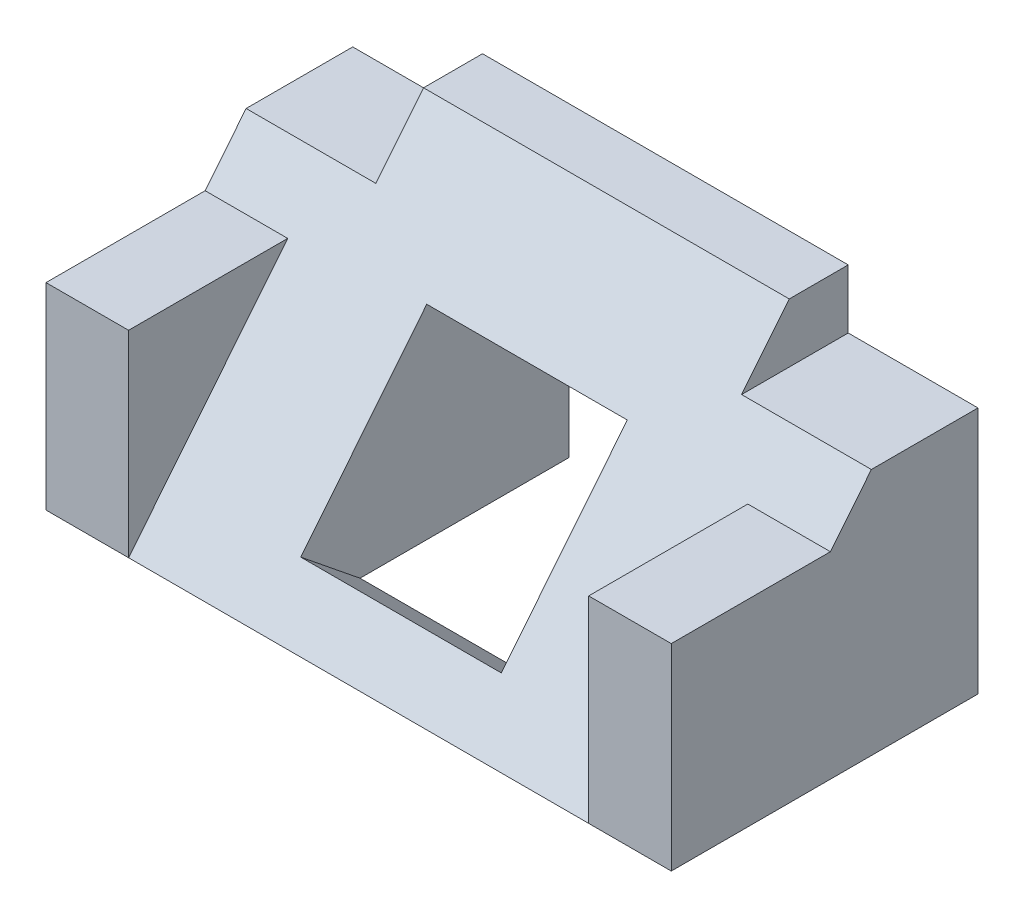
ISO-10303-21;
HEADER;
FILE_DESCRIPTION(('STEP AP214'),'2;1');
FILE_NAME('part.step','',(''),(''),'','','');
FILE_SCHEMA(('AUTOMOTIVE_DESIGN { 1 0 10303 214 1 1 1 1 }'));
ENDSEC;
DATA;
#1=APPLICATION_CONTEXT('core data for automotive mechanical design processes');
#2=APPLICATION_PROTOCOL_DEFINITION('international standard','automotive_design',2000,#1);
#3=PRODUCT_CONTEXT('',#1,'mechanical');
#4=PRODUCT('Part','Part','',(#3));
#5=PRODUCT_RELATED_PRODUCT_CATEGORY('part','',(#4));
#6=PRODUCT_DEFINITION_FORMATION('','',#4);
#7=PRODUCT_DEFINITION_CONTEXT('part definition',#1,'design');
#8=PRODUCT_DEFINITION('design','',#6,#7);
#9=PRODUCT_DEFINITION_SHAPE('','',#8);
#10=(LENGTH_UNIT() NAMED_UNIT(*) SI_UNIT(.MILLI.,.METRE.));
#11=(NAMED_UNIT(*) PLANE_ANGLE_UNIT() SI_UNIT($,.RADIAN.));
#12=(NAMED_UNIT(*) SI_UNIT($,.STERADIAN.) SOLID_ANGLE_UNIT());
#13=UNCERTAINTY_MEASURE_WITH_UNIT(LENGTH_MEASURE(1.E-05),#10,'distance_accuracy_value','');
#14=(GEOMETRIC_REPRESENTATION_CONTEXT(3) GLOBAL_UNCERTAINTY_ASSIGNED_CONTEXT((#13)) GLOBAL_UNIT_ASSIGNED_CONTEXT((#10,
#11,#12)) REPRESENTATION_CONTEXT('',''));
#15=CARTESIAN_POINT('',(0.,0.,0.));
#16=DIRECTION('',(0.,0.,1.));
#17=DIRECTION('',(1.,0.,0.));
#18=AXIS2_PLACEMENT_3D('',#15,#16,#17);
#19=CARTESIAN_POINT('',(1346.2,0.,-330.2));
#20=DIRECTION('',(0.,0.,-1.));
#21=DIRECTION('',(0.,1.,0.));
#22=AXIS2_PLACEMENT_3D('',#19,#20,#21);
#23=PLANE('',#22);
#24=DIRECTION('',(0.,1.,0.));
#25=VECTOR('',#24,1.);
#26=CARTESIAN_POINT('',(465.121503016354,0.,-330.2));
#27=LINE('',#26,#25);
#28=CARTESIAN_POINT('',(465.121503016354,-266.7,-330.2));
#29=VERTEX_POINT('',#28);
#30=CARTESIAN_POINT('',(465.121503016354,-74.5757407887315,-330.2));
#31=VERTEX_POINT('',#30);
#32=EDGE_CURVE('E190',#29,#31,#27,.T.);
#33=ORIENTED_EDGE('',*,*,#32,.F.);
#34=DIRECTION('',(-1.,0.,0.));
#35=VECTOR('',#34,1.);
#36=CARTESIAN_POINT('',(1346.2,-266.7,-330.2));
#37=LINE('',#36,#35);
#38=CARTESIAN_POINT('',(0.,-266.7,-330.2));
#39=VERTEX_POINT('',#38);
#40=EDGE_CURVE('E276',#29,#39,#37,.T.);
#41=ORIENTED_EDGE('',*,*,#40,.T.);
#42=DIRECTION('',(0.,-1.,0.));
#43=VECTOR('',#42,1.);
#44=CARTESIAN_POINT('',(0.,0.,-330.2));
#45=LINE('',#44,#43);
#46=CARTESIAN_POINT('',(0.,266.7,-330.2));
#47=VERTEX_POINT('',#46);
#48=EDGE_CURVE('E265',#47,#39,#45,.T.);
#49=ORIENTED_EDGE('',*,*,#48,.F.);
#50=DIRECTION('',(1.,0.,0.));
#51=VECTOR('',#50,1.);
#52=CARTESIAN_POINT('',(-3730.80958470451,266.7,-330.2));
#53=LINE('',#52,#51);
#54=CARTESIAN_POINT('',(279.4,266.7,-330.2));
#55=VERTEX_POINT('',#54);
#56=EDGE_CURVE('E243',#47,#55,#53,.T.);
#57=ORIENTED_EDGE('',*,*,#56,.T.);
#58=DIRECTION('',(0.,1.,0.));
#59=VECTOR('',#58,1.);
#60=CARTESIAN_POINT('',(279.4,393.7,-330.2));
#61=LINE('',#60,#59);
#62=CARTESIAN_POINT('',(279.4,393.7,-330.2));
#63=VERTEX_POINT('',#62);
#64=EDGE_CURVE('E236',#55,#63,#61,.T.);
#65=ORIENTED_EDGE('',*,*,#64,.T.);
#66=DIRECTION('',(-1.,0.,0.));
#67=VECTOR('',#66,1.);
#68=CARTESIAN_POINT('',(1346.2,393.7,-330.2));
#69=LINE('',#68,#67);
#70=CARTESIAN_POINT('',(1066.8,393.7,-330.2));
#71=VERTEX_POINT('',#70);
#72=EDGE_CURVE('E293',#71,#63,#69,.T.);
#73=ORIENTED_EDGE('',*,*,#72,.F.);
#74=DIRECTION('',(0.,1.,0.));
#75=VECTOR('',#74,1.);
#76=CARTESIAN_POINT('',(1066.8,393.7,-330.2));
#77=LINE('',#76,#75);
#78=CARTESIAN_POINT('',(1066.8,266.7,-330.2));
#79=VERTEX_POINT('',#78);
#80=EDGE_CURVE('E258',#79,#71,#77,.T.);
#81=ORIENTED_EDGE('',*,*,#80,.F.);
#82=DIRECTION('',(1.,0.,0.));
#83=VECTOR('',#82,1.);
#84=CARTESIAN_POINT('',(1066.8,266.7,-330.2));
#85=LINE('',#84,#83);
#86=CARTESIAN_POINT('',(1346.2,266.7,-330.2));
#87=VERTEX_POINT('',#86);
#88=EDGE_CURVE('E262',#79,#87,#85,.T.);
#89=ORIENTED_EDGE('',*,*,#88,.T.);
#90=DIRECTION('',(0.,-1.,0.));
#91=VECTOR('',#90,1.);
#92=CARTESIAN_POINT('',(1346.2,0.,-330.2));
#93=LINE('',#92,#91);
#94=CARTESIAN_POINT('',(1346.2,-266.7,-330.2));
#95=VERTEX_POINT('',#94);
#96=EDGE_CURVE('E268',#87,#95,#93,.T.);
#97=ORIENTED_EDGE('',*,*,#96,.T.);
#98=CARTESIAN_POINT('',(896.921503016354,-266.7,-330.2));
#99=VERTEX_POINT('',#98);
#100=EDGE_CURVE('E283',#95,#99,#37,.T.);
#101=ORIENTED_EDGE('',*,*,#100,.T.);
#102=DIRECTION('',(0.,1.,0.));
#103=VECTOR('',#102,1.);
#104=CARTESIAN_POINT('',(896.921503016354,0.,-330.2));
#105=LINE('',#104,#103);
#106=CARTESIAN_POINT('',(896.921503016354,-74.5757407887315,-330.2));
#107=VERTEX_POINT('',#106);
#108=EDGE_CURVE('E57',#99,#107,#105,.T.);
#109=ORIENTED_EDGE('',*,*,#108,.T.);
#110=DIRECTION('',(-1.,0.,0.));
#111=VECTOR('',#110,1.);
#112=CARTESIAN_POINT('',(1346.2,-74.5757407887315,-330.2));
#113=LINE('',#112,#111);
#114=EDGE_CURVE('E168',#107,#31,#113,.T.);
#115=ORIENTED_EDGE('',*,*,#114,.T.);
#116=EDGE_LOOP('',(#33,#41,#49,#57,#65,#73,#81,#89,#97,#101,#109,#115));
#117=FACE_BOUND('',#116,.T.);
#118=ADVANCED_FACE('F35',(#117),#23,.T.);
#119=CARTESIAN_POINT('',(1346.2,56.1096687555953,69.4691136974037));
#120=DIRECTION('',(0.,0.628337107087621,0.777941180203722));
#121=DIRECTION('',(0.,-0.777941180203722,0.628337107087621));
#122=AXIS2_PLACEMENT_3D('',#119,#120,#121);
#123=PLANE('',#122);
#124=DIRECTION('',(1.,0.,0.));
#125=VECTOR('',#124,1.);
#126=CARTESIAN_POINT('',(465.121503016354,-163.533175983661,246.872949832957));
#127=LINE('',#126,#125);
#128=CARTESIAN_POINT('',(465.121503016354,-163.533175983661,246.872949832957));
#129=VERTEX_POINT('',#128);
#130=CARTESIAN_POINT('',(896.921503016354,-163.533175983661,246.872949832957));
#131=VERTEX_POINT('',#130);
#132=EDGE_CURVE('E49',#129,#131,#127,.T.);
#133=ORIENTED_EDGE('',*,*,#132,.F.);
#134=DIRECTION('',(0.,-0.777941180203722,0.628337107087621));
#135=VECTOR('',#134,1.);
#136=CARTESIAN_POINT('',(465.121503016354,172.381825628306,-24.4430130074777));
#137=LINE('',#136,#135);
#138=CARTESIAN_POINT('',(465.121503016354,172.381825628306,-24.4430130074777));
#139=VERTEX_POINT('',#138);
#140=EDGE_CURVE('E180',#139,#129,#137,.T.);
#141=ORIENTED_EDGE('',*,*,#140,.F.);
#142=DIRECTION('',(1.,0.,0.));
#143=VECTOR('',#142,1.);
#144=CARTESIAN_POINT('',(465.121503016354,172.381825628306,-24.4430130074777));
#145=LINE('',#144,#143);
#146=CARTESIAN_POINT('',(896.921503016354,172.381825628306,-24.4430130074777));
#147=VERTEX_POINT('',#146);
#148=EDGE_CURVE('E165',#139,#147,#145,.T.);
#149=ORIENTED_EDGE('',*,*,#148,.T.);
#150=DIRECTION('',(0.,-0.777941180203722,0.628337107087621));
#151=VECTOR('',#150,1.);
#152=CARTESIAN_POINT('',(896.921503016354,172.381825628306,-24.4430130074777));
#153=LINE('',#152,#151);
#154=EDGE_CURVE('E173',#147,#131,#153,.T.);
#155=ORIENTED_EDGE('',*,*,#154,.T.);
#156=EDGE_LOOP('',(#133,#141,#149,#155));
#157=FACE_BOUND('',#156,.T.);
#158=DIRECTION('',(-1.,0.,0.));
#159=VECTOR('',#158,1.);
#160=CARTESIAN_POINT('',(1346.2,157.48,-12.4069230769231));
#161=LINE('',#160,#159);
#162=CARTESIAN_POINT('',(177.8,157.48,-12.4069230769231));
#163=VERTEX_POINT('',#162);
#164=CARTESIAN_POINT('',(0.,157.48,-12.4069230769231));
#165=VERTEX_POINT('',#164);
#166=EDGE_CURVE('E212',#163,#165,#161,.T.);
#167=ORIENTED_EDGE('',*,*,#166,.F.);
#168=DIRECTION('',(0.,0.777941180203722,-0.628337107087621));
#169=VECTOR('',#168,1.);
#170=CARTESIAN_POINT('',(177.8,56.1096687555953,69.4691136974037));
#171=LINE('',#170,#169);
#172=CARTESIAN_POINT('',(177.8,-266.7,330.2));
#173=VERTEX_POINT('',#172);
#174=EDGE_CURVE('E208',#173,#163,#171,.T.);
#175=ORIENTED_EDGE('',*,*,#174,.F.);
#176=DIRECTION('',(-1.,0.,0.));
#177=VECTOR('',#176,1.);
#178=CARTESIAN_POINT('',(1346.2,-266.7,330.2));
#179=LINE('',#178,#177);
#180=CARTESIAN_POINT('',(1168.4,-266.7,330.2));
#181=VERTEX_POINT('',#180);
#182=EDGE_CURVE('E286',#181,#173,#179,.T.);
#183=ORIENTED_EDGE('',*,*,#182,.F.);
#184=DIRECTION('',(0.,0.777941180203722,-0.628337107087621));
#185=VECTOR('',#184,1.);
#186=CARTESIAN_POINT('',(1168.4,56.1096687555953,69.4691136974037));
#187=LINE('',#186,#185);
#188=CARTESIAN_POINT('',(1168.4,157.48,-12.4069230769231));
#189=VERTEX_POINT('',#188);
#190=EDGE_CURVE('E228',#181,#189,#187,.T.);
#191=ORIENTED_EDGE('',*,*,#190,.T.);
#192=DIRECTION('',(-1.,0.,0.));
#193=VECTOR('',#192,1.);
#194=CARTESIAN_POINT('',(1346.2,157.48,-12.406923076923));
#195=LINE('',#194,#193);
#196=CARTESIAN_POINT('',(1346.2,157.48,-12.406923076923));
#197=VERTEX_POINT('',#196);
#198=EDGE_CURVE('E226',#197,#189,#195,.T.);
#199=ORIENTED_EDGE('',*,*,#198,.F.);
#200=DIRECTION('',(0.,0.777941180203722,-0.628337107087621));
#201=VECTOR('',#200,1.);
#202=CARTESIAN_POINT('',(1346.2,56.1096687555953,69.4691136974037));
#203=LINE('',#202,#201);
#204=CARTESIAN_POINT('',(1346.2,266.7,-100.623076923077));
#205=VERTEX_POINT('',#204);
#206=EDGE_CURVE('E270',#197,#205,#203,.T.);
#207=ORIENTED_EDGE('',*,*,#206,.T.);
#208=DIRECTION('',(1.,0.,0.));
#209=VECTOR('',#208,1.);
#210=CARTESIAN_POINT('',(1066.8,266.7,-100.623076923077));
#211=LINE('',#210,#209);
#212=CARTESIAN_POINT('',(1066.8,266.7,-100.623076923077));
#213=VERTEX_POINT('',#212);
#214=EDGE_CURVE('E260',#213,#205,#211,.T.);
#215=ORIENTED_EDGE('',*,*,#214,.F.);
#216=DIRECTION('',(0.,-0.777941180203722,0.628337107087621));
#217=VECTOR('',#216,1.);
#218=CARTESIAN_POINT('',(1066.8,266.7,-100.623076923077));
#219=LINE('',#218,#217);
#220=CARTESIAN_POINT('',(1066.8,393.7,-203.2));
#221=VERTEX_POINT('',#220);
#222=EDGE_CURVE('E252',#221,#213,#219,.T.);
#223=ORIENTED_EDGE('',*,*,#222,.F.);
#224=DIRECTION('',(-1.,0.,0.));
#225=VECTOR('',#224,1.);
#226=CARTESIAN_POINT('',(1346.2,393.7,-203.2));
#227=LINE('',#226,#225);
#228=CARTESIAN_POINT('',(279.4,393.7,-203.2));
#229=VERTEX_POINT('',#228);
#230=EDGE_CURVE('E290',#221,#229,#227,.T.);
#231=ORIENTED_EDGE('',*,*,#230,.T.);
#232=DIRECTION('',(0.,0.777941180203722,-0.628337107087621));
#233=VECTOR('',#232,1.);
#234=CARTESIAN_POINT('',(279.4,56.1096687555953,69.4691136974037));
#235=LINE('',#234,#233);
#236=CARTESIAN_POINT('',(279.4,266.7,-100.623076923077));
#237=VERTEX_POINT('',#236);
#238=EDGE_CURVE('E231',#237,#229,#235,.T.);
#239=ORIENTED_EDGE('',*,*,#238,.F.);
#240=DIRECTION('',(1.,0.,0.));
#241=VECTOR('',#240,1.);
#242=CARTESIAN_POINT('',(-3730.80958470451,266.7,-100.623076923077));
#243=LINE('',#242,#241);
#244=CARTESIAN_POINT('',(-8.88178419700125E-13,266.7,-100.623076923077));
#245=VERTEX_POINT('',#244);
#246=EDGE_CURVE('E235',#245,#237,#243,.T.);
#247=ORIENTED_EDGE('',*,*,#246,.F.);
#248=DIRECTION('',(0.,0.777941180203722,-0.628337107087621));
#249=VECTOR('',#248,1.);
#250=CARTESIAN_POINT('',(0.,56.1096687555953,69.4691136974037));
#251=LINE('',#250,#249);
#252=EDGE_CURVE('E279',#165,#245,#251,.T.);
#253=ORIENTED_EDGE('',*,*,#252,.F.);
#254=EDGE_LOOP('',(#167,#175,#183,#191,#199,#207,#215,#223,#231,#239,#247,#253));
#255=FACE_BOUND('',#254,.T.);
#256=ADVANCED_FACE('F177',(#157,#255),#123,.T.);
#257=CARTESIAN_POINT('',(0.,0.,0.));
#258=DIRECTION('',(1.,0.,0.));
#259=DIRECTION('',(0.,0.,-1.));
#260=AXIS2_PLACEMENT_3D('',#257,#258,#259);
#261=PLANE('',#260);
#262=ORIENTED_EDGE('',*,*,#48,.T.);
#263=DIRECTION('',(0.,0.,-1.));
#264=VECTOR('',#263,1.);
#265=CARTESIAN_POINT('',(0.,-266.7,0.));
#266=LINE('',#265,#264);
#267=CARTESIAN_POINT('',(0.,-266.7,330.2));
#268=VERTEX_POINT('',#267);
#269=EDGE_CURVE('E271',#268,#39,#266,.T.);
#270=ORIENTED_EDGE('',*,*,#269,.F.);
#271=DIRECTION('',(0.,1.,0.));
#272=VECTOR('',#271,1.);
#273=CARTESIAN_POINT('',(0.,-266.7,330.2));
#274=LINE('',#273,#272);
#275=CARTESIAN_POINT('',(0.,157.48,330.2));
#276=VERTEX_POINT('',#275);
#277=EDGE_CURVE('E193',#268,#276,#274,.T.);
#278=ORIENTED_EDGE('',*,*,#277,.T.);
#279=DIRECTION('',(0.,0.,-1.));
#280=VECTOR('',#279,1.);
#281=CARTESIAN_POINT('',(0.,157.48,-330.2));
#282=LINE('',#281,#280);
#283=EDGE_CURVE('E198',#276,#165,#282,.T.);
#284=ORIENTED_EDGE('',*,*,#283,.T.);
#285=ORIENTED_EDGE('',*,*,#252,.T.);
#286=DIRECTION('',(0.,0.,-1.));
#287=VECTOR('',#286,1.);
#288=CARTESIAN_POINT('',(0.,266.7,-330.2));
#289=LINE('',#288,#287);
#290=EDGE_CURVE('E238',#245,#47,#289,.T.);
#291=ORIENTED_EDGE('',*,*,#290,.T.);
#292=EDGE_LOOP('',(#262,#270,#278,#284,#285,#291));
#293=FACE_BOUND('',#292,.T.);
#294=ADVANCED_FACE('F332',(#293),#261,.F.);
#295=CARTESIAN_POINT('',(1346.2,393.7,-1.72084568816899E-13));
#296=DIRECTION('',(0.,1.,0.));
#297=DIRECTION('',(0.,0.,1.));
#298=AXIS2_PLACEMENT_3D('',#295,#296,#297);
#299=PLANE('',#298);
#300=DIRECTION('',(0.,0.,-1.));
#301=VECTOR('',#300,1.);
#302=CARTESIAN_POINT('',(279.4,393.7,-1.72084568816899E-13));
#303=LINE('',#302,#301);
#304=EDGE_CURVE('E240',#229,#63,#303,.T.);
#305=ORIENTED_EDGE('',*,*,#304,.F.);
#306=ORIENTED_EDGE('',*,*,#230,.F.);
#307=DIRECTION('',(0.,0.,1.));
#308=VECTOR('',#307,1.);
#309=CARTESIAN_POINT('',(1066.8,393.7,-203.2));
#310=LINE('',#309,#308);
#311=EDGE_CURVE('E250',#71,#221,#310,.T.);
#312=ORIENTED_EDGE('',*,*,#311,.F.);
#313=ORIENTED_EDGE('',*,*,#72,.T.);
#314=EDGE_LOOP('',(#305,#306,#312,#313));
#315=FACE_BOUND('',#314,.T.);
#316=ADVANCED_FACE('F348',(#315),#299,.T.);
#317=CARTESIAN_POINT('',(1346.2,-266.7,0.));
#318=DIRECTION('',(0.,1.,0.));
#319=DIRECTION('',(0.,0.,1.));
#320=AXIS2_PLACEMENT_3D('',#317,#318,#319);
#321=PLANE('',#320);
#322=ORIENTED_EDGE('',*,*,#40,.F.);
#323=DIRECTION('',(0.,0.,1.));
#324=VECTOR('',#323,1.);
#325=CARTESIAN_POINT('',(465.121503016354,-266.7,0.));
#326=LINE('',#325,#324);
#327=CARTESIAN_POINT('',(465.121503016354,-266.7,119.142596288918));
#328=VERTEX_POINT('',#327);
#329=EDGE_CURVE('E11',#29,#328,#326,.T.);
#330=ORIENTED_EDGE('',*,*,#329,.T.);
#331=DIRECTION('',(1.,0.,0.));
#332=VECTOR('',#331,1.);
#333=CARTESIAN_POINT('',(1346.2,-266.7,119.142596288919));
#334=LINE('',#333,#332);
#335=CARTESIAN_POINT('',(896.921503016354,-266.7,119.142596288918));
#336=VERTEX_POINT('',#335);
#337=EDGE_CURVE('E42',#328,#336,#334,.T.);
#338=ORIENTED_EDGE('',*,*,#337,.T.);
#339=DIRECTION('',(0.,0.,1.));
#340=VECTOR('',#339,1.);
#341=CARTESIAN_POINT('',(896.921503016354,-266.7,0.));
#342=LINE('',#341,#340);
#343=EDGE_CURVE('E296',#99,#336,#342,.T.);
#344=ORIENTED_EDGE('',*,*,#343,.F.);
#345=ORIENTED_EDGE('',*,*,#100,.F.);
#346=DIRECTION('',(0.,0.,-1.));
#347=VECTOR('',#346,1.);
#348=CARTESIAN_POINT('',(1346.2,-266.7,0.));
#349=LINE('',#348,#347);
#350=CARTESIAN_POINT('',(1346.2,-266.7,330.2));
#351=VERTEX_POINT('',#350);
#352=EDGE_CURVE('E273',#351,#95,#349,.T.);
#353=ORIENTED_EDGE('',*,*,#352,.F.);
#354=EDGE_CURVE('E287',#351,#181,#179,.T.);
#355=ORIENTED_EDGE('',*,*,#354,.T.);
#356=ORIENTED_EDGE('',*,*,#182,.T.);
#357=DIRECTION('',(-1.,0.,0.));
#358=VECTOR('',#357,1.);
#359=CARTESIAN_POINT('',(177.8,-266.7,330.2));
#360=LINE('',#359,#358);
#361=EDGE_CURVE('E201',#173,#268,#360,.T.);
#362=ORIENTED_EDGE('',*,*,#361,.T.);
#363=ORIENTED_EDGE('',*,*,#269,.T.);
#364=EDGE_LOOP('',(#322,#330,#338,#344,#345,#353,#355,#356,#362,#363));
#365=FACE_BOUND('',#364,.T.);
#366=ADVANCED_FACE('F300',(#365),#321,.F.);
#367=CARTESIAN_POINT('',(1346.2,0.,0.));
#368=DIRECTION('',(1.,0.,0.));
#369=DIRECTION('',(0.,0.,-1.));
#370=AXIS2_PLACEMENT_3D('',#367,#368,#369);
#371=PLANE('',#370);
#372=ORIENTED_EDGE('',*,*,#206,.F.);
#373=DIRECTION('',(0.,0.,1.));
#374=VECTOR('',#373,1.);
#375=CARTESIAN_POINT('',(1346.2,157.48,-330.2));
#376=LINE('',#375,#374);
#377=CARTESIAN_POINT('',(1346.2,157.48,330.2));
#378=VERTEX_POINT('',#377);
#379=EDGE_CURVE('E214',#197,#378,#376,.T.);
#380=ORIENTED_EDGE('',*,*,#379,.T.);
#381=DIRECTION('',(0.,-1.,0.));
#382=VECTOR('',#381,1.);
#383=CARTESIAN_POINT('',(1346.2,-266.7,330.2));
#384=LINE('',#383,#382);
#385=EDGE_CURVE('E218',#378,#351,#384,.T.);
#386=ORIENTED_EDGE('',*,*,#385,.T.);
#387=ORIENTED_EDGE('',*,*,#352,.T.);
#388=ORIENTED_EDGE('',*,*,#96,.F.);
#389=DIRECTION('',(0.,0.,-1.));
#390=VECTOR('',#389,1.);
#391=CARTESIAN_POINT('',(1346.2,266.7,-330.2));
#392=LINE('',#391,#390);
#393=EDGE_CURVE('E245',#205,#87,#392,.T.);
#394=ORIENTED_EDGE('',*,*,#393,.F.);
#395=EDGE_LOOP('',(#372,#380,#386,#387,#388,#394));
#396=FACE_BOUND('',#395,.T.);
#397=ADVANCED_FACE('F313',(#396),#371,.T.);
#398=CARTESIAN_POINT('',(1066.8,266.7,-330.2));
#399=DIRECTION('',(0.,-1.,0.));
#400=DIRECTION('',(0.,0.,-1.));
#401=AXIS2_PLACEMENT_3D('',#398,#399,#400);
#402=PLANE('',#401);
#403=ORIENTED_EDGE('',*,*,#393,.T.);
#404=ORIENTED_EDGE('',*,*,#88,.F.);
#405=DIRECTION('',(0.,0.,-1.));
#406=VECTOR('',#405,1.);
#407=CARTESIAN_POINT('',(1066.8,266.7,-330.2));
#408=LINE('',#407,#406);
#409=EDGE_CURVE('E255',#213,#79,#408,.T.);
#410=ORIENTED_EDGE('',*,*,#409,.F.);
#411=ORIENTED_EDGE('',*,*,#214,.T.);
#412=EDGE_LOOP('',(#403,#404,#410,#411));
#413=FACE_BOUND('',#412,.T.);
#414=ADVANCED_FACE('F355',(#413),#402,.F.);
#415=CARTESIAN_POINT('',(1066.8,0.,0.));
#416=DIRECTION('',(-1.,0.,0.));
#417=DIRECTION('',(0.,0.,1.));
#418=AXIS2_PLACEMENT_3D('',#415,#416,#417);
#419=PLANE('',#418);
#420=ORIENTED_EDGE('',*,*,#311,.T.);
#421=ORIENTED_EDGE('',*,*,#222,.T.);
#422=ORIENTED_EDGE('',*,*,#409,.T.);
#423=ORIENTED_EDGE('',*,*,#80,.T.);
#424=EDGE_LOOP('',(#420,#421,#422,#423));
#425=FACE_BOUND('',#424,.T.);
#426=ADVANCED_FACE('F352',(#425),#419,.F.);
#427=CARTESIAN_POINT('',(-3730.80958470451,266.7,-330.2));
#428=DIRECTION('',(0.,1.,0.));
#429=DIRECTION('',(0.,0.,1.));
#430=AXIS2_PLACEMENT_3D('',#427,#428,#429);
#431=PLANE('',#430);
#432=ORIENTED_EDGE('',*,*,#290,.F.);
#433=ORIENTED_EDGE('',*,*,#246,.T.);
#434=DIRECTION('',(0.,0.,-1.));
#435=VECTOR('',#434,1.);
#436=CARTESIAN_POINT('',(279.4,266.7,-330.2));
#437=LINE('',#436,#435);
#438=EDGE_CURVE('E232',#237,#55,#437,.T.);
#439=ORIENTED_EDGE('',*,*,#438,.T.);
#440=ORIENTED_EDGE('',*,*,#56,.F.);
#441=EDGE_LOOP('',(#432,#433,#439,#440));
#442=FACE_BOUND('',#441,.T.);
#443=ADVANCED_FACE('F339',(#442),#431,.T.);
#444=CARTESIAN_POINT('',(279.4,0.,0.));
#445=DIRECTION('',(1.,0.,0.));
#446=DIRECTION('',(0.,0.,-1.));
#447=AXIS2_PLACEMENT_3D('',#444,#445,#446);
#448=PLANE('',#447);
#449=ORIENTED_EDGE('',*,*,#64,.F.);
#450=ORIENTED_EDGE('',*,*,#438,.F.);
#451=ORIENTED_EDGE('',*,*,#238,.T.);
#452=ORIENTED_EDGE('',*,*,#304,.T.);
#453=EDGE_LOOP('',(#449,#450,#451,#452));
#454=FACE_BOUND('',#453,.T.);
#455=ADVANCED_FACE('F343',(#454),#448,.F.);
#456=CARTESIAN_POINT('',(1168.4,-266.7,330.2));
#457=DIRECTION('',(0.,0.,1.));
#458=DIRECTION('',(1.,0.,0.));
#459=AXIS2_PLACEMENT_3D('',#456,#457,#458);
#460=PLANE('',#459);
#461=ORIENTED_EDGE('',*,*,#385,.F.);
#462=DIRECTION('',(1.,0.,0.));
#463=VECTOR('',#462,1.);
#464=CARTESIAN_POINT('',(1168.4,157.48,330.2));
#465=LINE('',#464,#463);
#466=CARTESIAN_POINT('',(1168.4,157.48,330.2));
#467=VERTEX_POINT('',#466);
#468=EDGE_CURVE('E220',#467,#378,#465,.T.);
#469=ORIENTED_EDGE('',*,*,#468,.F.);
#470=DIRECTION('',(0.,-1.,0.));
#471=VECTOR('',#470,1.);
#472=CARTESIAN_POINT('',(1168.4,-266.7,330.2));
#473=LINE('',#472,#471);
#474=EDGE_CURVE('E217',#467,#181,#473,.T.);
#475=ORIENTED_EDGE('',*,*,#474,.T.);
#476=ORIENTED_EDGE('',*,*,#354,.F.);
#477=EDGE_LOOP('',(#461,#469,#475,#476));
#478=FACE_BOUND('',#477,.T.);
#479=ADVANCED_FACE('F318',(#478),#460,.T.);
#480=CARTESIAN_POINT('',(1168.4,157.48,-330.2));
#481=DIRECTION('',(0.,1.,0.));
#482=DIRECTION('',(0.,0.,1.));
#483=AXIS2_PLACEMENT_3D('',#480,#481,#482);
#484=PLANE('',#483);
#485=ORIENTED_EDGE('',*,*,#379,.F.);
#486=ORIENTED_EDGE('',*,*,#198,.T.);
#487=DIRECTION('',(0.,0.,1.));
#488=VECTOR('',#487,1.);
#489=CARTESIAN_POINT('',(1168.4,157.48,-330.2));
#490=LINE('',#489,#488);
#491=EDGE_CURVE('E215',#189,#467,#490,.T.);
#492=ORIENTED_EDGE('',*,*,#491,.T.);
#493=ORIENTED_EDGE('',*,*,#468,.T.);
#494=EDGE_LOOP('',(#485,#486,#492,#493));
#495=FACE_BOUND('',#494,.T.);
#496=ADVANCED_FACE('F400',(#495),#484,.T.);
#497=CARTESIAN_POINT('',(1168.4,0.,0.));
#498=DIRECTION('',(1.,0.,0.));
#499=DIRECTION('',(0.,0.,-1.));
#500=AXIS2_PLACEMENT_3D('',#497,#498,#499);
#501=PLANE('',#500);
#502=ORIENTED_EDGE('',*,*,#190,.F.);
#503=ORIENTED_EDGE('',*,*,#474,.F.);
#504=ORIENTED_EDGE('',*,*,#491,.F.);
#505=EDGE_LOOP('',(#502,#503,#504));
#506=FACE_BOUND('',#505,.T.);
#507=ADVANCED_FACE('F324',(#506),#501,.F.);
#508=CARTESIAN_POINT('',(177.8,157.48,-330.2));
#509=DIRECTION('',(0.,1.,0.));
#510=DIRECTION('',(0.,0.,1.));
#511=AXIS2_PLACEMENT_3D('',#508,#509,#510);
#512=PLANE('',#511);
#513=DIRECTION('',(0.,0.,-1.));
#514=VECTOR('',#513,1.);
#515=CARTESIAN_POINT('',(177.8,157.48,-330.2));
#516=LINE('',#515,#514);
#517=CARTESIAN_POINT('',(177.8,157.48,330.2));
#518=VERTEX_POINT('',#517);
#519=EDGE_CURVE('E197',#518,#163,#516,.T.);
#520=ORIENTED_EDGE('',*,*,#519,.T.);
#521=ORIENTED_EDGE('',*,*,#166,.T.);
#522=ORIENTED_EDGE('',*,*,#283,.F.);
#523=DIRECTION('',(-1.,0.,0.));
#524=VECTOR('',#523,1.);
#525=CARTESIAN_POINT('',(177.8,157.48,330.2));
#526=LINE('',#525,#524);
#527=EDGE_CURVE('E206',#518,#276,#526,.T.);
#528=ORIENTED_EDGE('',*,*,#527,.F.);
#529=EDGE_LOOP('',(#520,#521,#522,#528));
#530=FACE_BOUND('',#529,.T.);
#531=ADVANCED_FACE('F418',(#530),#512,.T.);
#532=CARTESIAN_POINT('',(177.8,-266.7,330.2));
#533=DIRECTION('',(0.,0.,1.));
#534=DIRECTION('',(1.,0.,0.));
#535=AXIS2_PLACEMENT_3D('',#532,#533,#534);
#536=PLANE('',#535);
#537=ORIENTED_EDGE('',*,*,#277,.F.);
#538=ORIENTED_EDGE('',*,*,#361,.F.);
#539=DIRECTION('',(0.,1.,0.));
#540=VECTOR('',#539,1.);
#541=CARTESIAN_POINT('',(177.8,-266.7,330.2));
#542=LINE('',#541,#540);
#543=EDGE_CURVE('E194',#173,#518,#542,.T.);
#544=ORIENTED_EDGE('',*,*,#543,.T.);
#545=ORIENTED_EDGE('',*,*,#527,.T.);
#546=EDGE_LOOP('',(#537,#538,#544,#545));
#547=FACE_BOUND('',#546,.T.);
#548=ADVANCED_FACE('F434',(#547),#536,.T.);
#549=CARTESIAN_POINT('',(177.8,0.,0.));
#550=DIRECTION('',(1.,0.,0.));
#551=DIRECTION('',(0.,0.,-1.));
#552=AXIS2_PLACEMENT_3D('',#549,#550,#551);
#553=PLANE('',#552);
#554=ORIENTED_EDGE('',*,*,#543,.F.);
#555=ORIENTED_EDGE('',*,*,#174,.T.);
#556=ORIENTED_EDGE('',*,*,#519,.F.);
#557=EDGE_LOOP('',(#554,#555,#556));
#558=FACE_BOUND('',#557,.T.);
#559=ADVANCED_FACE('F444',(#558),#553,.T.);
#560=CARTESIAN_POINT('',(465.121503016354,-578.487001504326,-266.879405573581));
#561=DIRECTION('',(0.,-0.777941180203722,0.628337107087621));
#562=DIRECTION('',(0.,-0.628337107087621,-0.777941180203722));
#563=AXIS2_PLACEMENT_3D('',#560,#561,#562);
#564=PLANE('',#563);
#565=DIRECTION('',(0.,0.628337107087621,0.777941180203722));
#566=VECTOR('',#565,1.);
#567=CARTESIAN_POINT('',(465.121503016354,-578.487001504326,-266.879405573581));
#568=LINE('',#567,#566);
#569=EDGE_CURVE('E185',#328,#129,#568,.T.);
#570=ORIENTED_EDGE('',*,*,#569,.T.);
#571=ORIENTED_EDGE('',*,*,#132,.T.);
#572=DIRECTION('',(0.,0.628337107087621,0.777941180203722));
#573=VECTOR('',#572,1.);
#574=CARTESIAN_POINT('',(896.921503016354,-578.487001504326,-266.879405573581));
#575=LINE('',#574,#573);
#576=EDGE_CURVE('E170',#336,#131,#575,.T.);
#577=ORIENTED_EDGE('',*,*,#576,.F.);
#578=ORIENTED_EDGE('',*,*,#337,.F.);
#579=EDGE_LOOP('',(#570,#571,#577,#578));
#580=FACE_BOUND('',#579,.T.);
#581=ADVANCED_FACE('F303',(#580),#564,.F.);
#582=CARTESIAN_POINT('',(465.121503016354,-242.571999892359,-538.195368414016));
#583=DIRECTION('',(-1.,0.,0.));
#584=DIRECTION('',(0.,-1.,0.));
#585=AXIS2_PLACEMENT_3D('',#582,#583,#584);
#586=PLANE('',#585);
#587=ORIENTED_EDGE('',*,*,#32,.T.);
#588=DIRECTION('',(0.,0.628337107087621,0.777941180203722));
#589=VECTOR('',#588,1.);
#590=CARTESIAN_POINT('',(465.121503016354,-242.571999892359,-538.195368414016));
#591=LINE('',#590,#589);
#592=EDGE_CURVE('E169',#31,#139,#591,.T.);
#593=ORIENTED_EDGE('',*,*,#592,.T.);
#594=ORIENTED_EDGE('',*,*,#140,.T.);
#595=ORIENTED_EDGE('',*,*,#569,.F.);
#596=ORIENTED_EDGE('',*,*,#329,.F.);
#597=EDGE_LOOP('',(#587,#593,#594,#595,#596));
#598=FACE_BOUND('',#597,.T.);
#599=ADVANCED_FACE('F305',(#598),#586,.F.);
#600=CARTESIAN_POINT('',(465.121503016354,-242.571999892359,-538.195368414016));
#601=DIRECTION('',(0.,-0.777941180203722,0.628337107087621));
#602=DIRECTION('',(0.,-0.628337107087621,-0.777941180203722));
#603=AXIS2_PLACEMENT_3D('',#600,#601,#602);
#604=PLANE('',#603);
#605=DIRECTION('',(0.,0.628337107087621,0.777941180203722));
#606=VECTOR('',#605,1.);
#607=CARTESIAN_POINT('',(896.921503016354,-242.571999892359,-538.195368414016));
#608=LINE('',#607,#606);
#609=EDGE_CURVE('E160',#107,#147,#608,.T.);
#610=ORIENTED_EDGE('',*,*,#609,.T.);
#611=ORIENTED_EDGE('',*,*,#148,.F.);
#612=ORIENTED_EDGE('',*,*,#592,.F.);
#613=ORIENTED_EDGE('',*,*,#114,.F.);
#614=EDGE_LOOP('',(#610,#611,#612,#613));
#615=FACE_BOUND('',#614,.T.);
#616=ADVANCED_FACE('F162',(#615),#604,.T.);
#617=CARTESIAN_POINT('',(896.921503016354,-242.571999892359,-538.195368414016));
#618=DIRECTION('',(-1.,0.,0.));
#619=DIRECTION('',(0.,0.,1.));
#620=AXIS2_PLACEMENT_3D('',#617,#618,#619);
#621=PLANE('',#620);
#622=ORIENTED_EDGE('',*,*,#343,.T.);
#623=ORIENTED_EDGE('',*,*,#576,.T.);
#624=ORIENTED_EDGE('',*,*,#154,.F.);
#625=ORIENTED_EDGE('',*,*,#609,.F.);
#626=ORIENTED_EDGE('',*,*,#108,.F.);
#627=EDGE_LOOP('',(#622,#623,#624,#625,#626));
#628=FACE_BOUND('',#627,.T.);
#629=ADVANCED_FACE('F174',(#628),#621,.T.);
#630=CLOSED_SHELL('',(#118,#256,#294,#316,#366,#397,#414,#426,#443,#455,#479,#496,#507,#531,
#548,#559,#581,#599,#616,#629));
#631=MANIFOLD_SOLID_BREP('B2',#630);
#632=ADVANCED_BREP_SHAPE_REPRESENTATION('',(#18,#631),#14);
#633=SHAPE_DEFINITION_REPRESENTATION(#9,#632);
ENDSEC;
END-ISO-10303-21;
